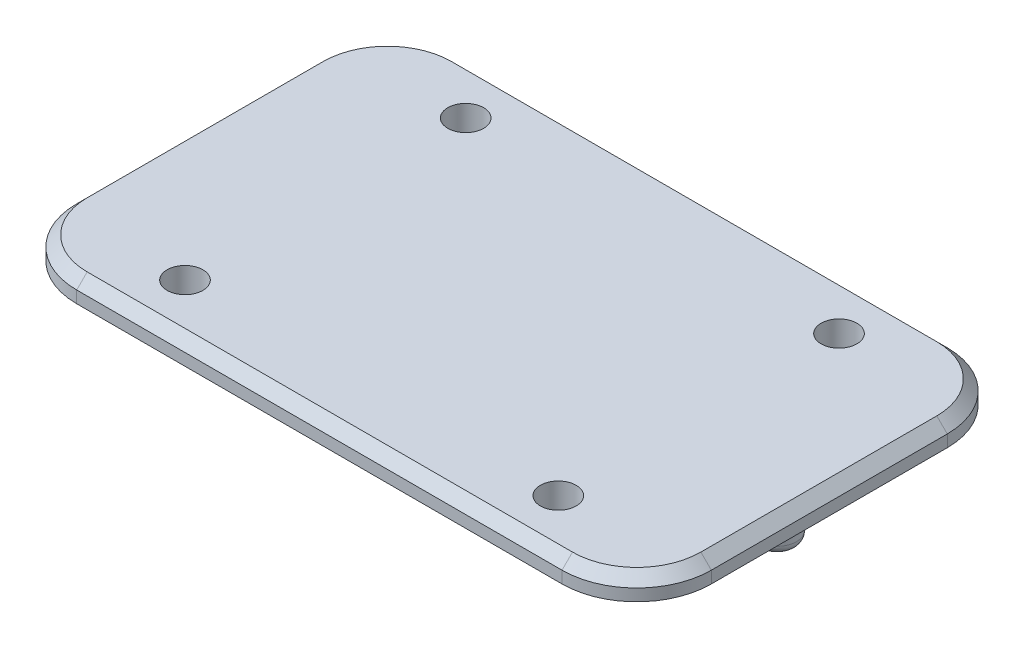
ISO-10303-21;
HEADER;
FILE_DESCRIPTION(('STEP AP214'),'2;1');
FILE_NAME('part.step','',(''),(''),'','','');
FILE_SCHEMA(('AUTOMOTIVE_DESIGN { 1 0 10303 214 1 1 1 1 }'));
ENDSEC;
DATA;
#1=APPLICATION_CONTEXT('core data for automotive mechanical design processes');
#2=APPLICATION_PROTOCOL_DEFINITION('international standard','automotive_design',2000,#1);
#3=PRODUCT_CONTEXT('',#1,'mechanical');
#4=PRODUCT('Part','Part','',(#3));
#5=PRODUCT_RELATED_PRODUCT_CATEGORY('part','',(#4));
#6=PRODUCT_DEFINITION_FORMATION('','',#4);
#7=PRODUCT_DEFINITION_CONTEXT('part definition',#1,'design');
#8=PRODUCT_DEFINITION('design','',#6,#7);
#9=PRODUCT_DEFINITION_SHAPE('','',#8);
#10=(LENGTH_UNIT() NAMED_UNIT(*) SI_UNIT(.MILLI.,.METRE.));
#11=(NAMED_UNIT(*) PLANE_ANGLE_UNIT() SI_UNIT($,.RADIAN.));
#12=(NAMED_UNIT(*) SI_UNIT($,.STERADIAN.) SOLID_ANGLE_UNIT());
#13=UNCERTAINTY_MEASURE_WITH_UNIT(LENGTH_MEASURE(1.E-05),#10,'distance_accuracy_value','');
#14=(GEOMETRIC_REPRESENTATION_CONTEXT(3) GLOBAL_UNCERTAINTY_ASSIGNED_CONTEXT((#13)) GLOBAL_UNIT_ASSIGNED_CONTEXT((#10,
#11,#12)) REPRESENTATION_CONTEXT('',''));
#15=CARTESIAN_POINT('',(0.,0.,0.));
#16=DIRECTION('',(0.,0.,1.));
#17=DIRECTION('',(1.,0.,0.));
#18=AXIS2_PLACEMENT_3D('',#15,#16,#17);
#19=CARTESIAN_POINT('',(21.25,1.5,-12.9));
#20=DIRECTION('',(0.,0.,1.));
#21=DIRECTION('',(1.,0.,0.));
#22=AXIS2_PLACEMENT_3D('',#19,#20,#21);
#23=PLANE('',#22);
#24=DIRECTION('',(0.,-1.,0.));
#25=VECTOR('',#24,1.);
#26=CARTESIAN_POINT('',(-16.25,1.5,-12.9));
#27=LINE('',#26,#25);
#28=CARTESIAN_POINT('',(-16.25,0.,-12.9));
#29=VERTEX_POINT('',#28);
#30=CARTESIAN_POINT('',(-16.25,0.799999999999987,-12.9));
#31=VERTEX_POINT('',#30);
#32=EDGE_CURVE('E330',#29,#31,#27,.F.);
#33=ORIENTED_EDGE('',*,*,#32,.T.);
#34=DIRECTION('',(1.,0.,0.));
#35=VECTOR('',#34,1.);
#36=CARTESIAN_POINT('',(16.25,0.799999999999987,-12.9));
#37=LINE('',#36,#35);
#38=CARTESIAN_POINT('',(16.25,0.799999999999987,-12.9));
#39=VERTEX_POINT('',#38);
#40=EDGE_CURVE('E364',#31,#39,#37,.T.);
#41=ORIENTED_EDGE('',*,*,#40,.T.);
#42=DIRECTION('',(0.,-1.,0.));
#43=VECTOR('',#42,1.);
#44=CARTESIAN_POINT('',(16.25,1.5,-12.9));
#45=LINE('',#44,#43);
#46=CARTESIAN_POINT('',(16.25,0.,-12.9));
#47=VERTEX_POINT('',#46);
#48=EDGE_CURVE('E333',#39,#47,#45,.T.);
#49=ORIENTED_EDGE('',*,*,#48,.T.);
#50=DIRECTION('',(-1.,0.,0.));
#51=VECTOR('',#50,1.);
#52=CARTESIAN_POINT('',(21.25,0.,-12.9));
#53=LINE('',#52,#51);
#54=EDGE_CURVE('E299',#47,#29,#53,.T.);
#55=ORIENTED_EDGE('',*,*,#54,.T.);
#56=EDGE_LOOP('',(#33,#41,#49,#55));
#57=FACE_BOUND('',#56,.T.);
#58=ADVANCED_FACE('F34',(#57),#23,.F.);
#59=CARTESIAN_POINT('',(-21.25,1.5,-12.9));
#60=DIRECTION('',(1.,0.,0.));
#61=DIRECTION('',(0.,0.,-1.));
#62=AXIS2_PLACEMENT_3D('',#59,#60,#61);
#63=PLANE('',#62);
#64=DIRECTION('',(0.,-1.,0.));
#65=VECTOR('',#64,1.);
#66=CARTESIAN_POINT('',(-21.25,1.5,7.9));
#67=LINE('',#66,#65);
#68=CARTESIAN_POINT('',(-21.25,0.,7.89999999999999));
#69=VERTEX_POINT('',#68);
#70=CARTESIAN_POINT('',(-21.25,0.799999999999987,7.9));
#71=VERTEX_POINT('',#70);
#72=EDGE_CURVE('E335',#69,#71,#67,.F.);
#73=ORIENTED_EDGE('',*,*,#72,.T.);
#74=DIRECTION('',(0.,0.,-1.));
#75=VECTOR('',#74,1.);
#76=CARTESIAN_POINT('',(-21.25,0.799999999999987,-7.9));
#77=LINE('',#76,#75);
#78=CARTESIAN_POINT('',(-21.25,0.799999999999987,-7.9));
#79=VERTEX_POINT('',#78);
#80=EDGE_CURVE('E372',#71,#79,#77,.T.);
#81=ORIENTED_EDGE('',*,*,#80,.T.);
#82=DIRECTION('',(0.,-1.,0.));
#83=VECTOR('',#82,1.);
#84=CARTESIAN_POINT('',(-21.25,1.5,-7.9));
#85=LINE('',#84,#83);
#86=CARTESIAN_POINT('',(-21.25,0.,-7.9));
#87=VERTEX_POINT('',#86);
#88=EDGE_CURVE('E338',#79,#87,#85,.T.);
#89=ORIENTED_EDGE('',*,*,#88,.T.);
#90=DIRECTION('',(0.,0.,1.));
#91=VECTOR('',#90,1.);
#92=CARTESIAN_POINT('',(-21.25,0.,-12.9));
#93=LINE('',#92,#91);
#94=EDGE_CURVE('E302',#87,#69,#93,.T.);
#95=ORIENTED_EDGE('',*,*,#94,.T.);
#96=EDGE_LOOP('',(#73,#81,#89,#95));
#97=FACE_BOUND('',#96,.T.);
#98=ADVANCED_FACE('F484',(#97),#63,.F.);
#99=CARTESIAN_POINT('',(21.25,1.5,12.9));
#100=DIRECTION('',(0.,0.,-1.));
#101=DIRECTION('',(-1.,0.,0.));
#102=AXIS2_PLACEMENT_3D('',#99,#100,#101);
#103=PLANE('',#102);
#104=DIRECTION('',(0.,-1.,0.));
#105=VECTOR('',#104,1.);
#106=CARTESIAN_POINT('',(16.25,1.5,12.9));
#107=LINE('',#106,#105);
#108=CARTESIAN_POINT('',(16.25,0.,12.9));
#109=VERTEX_POINT('',#108);
#110=CARTESIAN_POINT('',(16.25,0.799999999999987,12.9));
#111=VERTEX_POINT('',#110);
#112=EDGE_CURVE('E327',#109,#111,#107,.F.);
#113=ORIENTED_EDGE('',*,*,#112,.T.);
#114=DIRECTION('',(-1.,0.,0.));
#115=VECTOR('',#114,1.);
#116=CARTESIAN_POINT('',(-16.25,0.799999999999987,12.9));
#117=LINE('',#116,#115);
#118=CARTESIAN_POINT('',(-16.25,0.799999999999987,12.9));
#119=VERTEX_POINT('',#118);
#120=EDGE_CURVE('E366',#111,#119,#117,.T.);
#121=ORIENTED_EDGE('',*,*,#120,.T.);
#122=DIRECTION('',(0.,-1.,0.));
#123=VECTOR('',#122,1.);
#124=CARTESIAN_POINT('',(-16.25,1.5,12.9));
#125=LINE('',#124,#123);
#126=CARTESIAN_POINT('',(-16.25,0.,12.9));
#127=VERTEX_POINT('',#126);
#128=EDGE_CURVE('E325',#119,#127,#125,.T.);
#129=ORIENTED_EDGE('',*,*,#128,.T.);
#130=DIRECTION('',(1.,0.,0.));
#131=VECTOR('',#130,1.);
#132=CARTESIAN_POINT('',(21.25,0.,12.9));
#133=LINE('',#132,#131);
#134=EDGE_CURVE('E306',#127,#109,#133,.T.);
#135=ORIENTED_EDGE('',*,*,#134,.T.);
#136=EDGE_LOOP('',(#113,#121,#129,#135));
#137=FACE_BOUND('',#136,.T.);
#138=ADVANCED_FACE('F490',(#137),#103,.F.);
#139=CARTESIAN_POINT('',(21.25,1.5,-12.9));
#140=DIRECTION('',(-1.,0.,0.));
#141=DIRECTION('',(0.,0.,1.));
#142=AXIS2_PLACEMENT_3D('',#139,#140,#141);
#143=PLANE('',#142);
#144=DIRECTION('',(0.,-1.,0.));
#145=VECTOR('',#144,1.);
#146=CARTESIAN_POINT('',(21.25,1.5,-7.9));
#147=LINE('',#146,#145);
#148=CARTESIAN_POINT('',(21.25,0.,-7.9));
#149=VERTEX_POINT('',#148);
#150=CARTESIAN_POINT('',(21.25,0.799999999999987,-7.9));
#151=VERTEX_POINT('',#150);
#152=EDGE_CURVE('E312',#149,#151,#147,.F.);
#153=ORIENTED_EDGE('',*,*,#152,.T.);
#154=DIRECTION('',(0.,0.,1.));
#155=VECTOR('',#154,1.);
#156=CARTESIAN_POINT('',(21.25,0.799999999999987,7.89999999999999));
#157=LINE('',#156,#155);
#158=CARTESIAN_POINT('',(21.25,0.799999999999987,7.9));
#159=VERTEX_POINT('',#158);
#160=EDGE_CURVE('E357',#151,#159,#157,.T.);
#161=ORIENTED_EDGE('',*,*,#160,.T.);
#162=DIRECTION('',(0.,-1.,0.));
#163=VECTOR('',#162,1.);
#164=CARTESIAN_POINT('',(21.25,1.5,7.9));
#165=LINE('',#164,#163);
#166=CARTESIAN_POINT('',(21.25,0.,7.89999999999999));
#167=VERTEX_POINT('',#166);
#168=EDGE_CURVE('E315',#159,#167,#165,.T.);
#169=ORIENTED_EDGE('',*,*,#168,.T.);
#170=DIRECTION('',(0.,0.,-1.));
#171=VECTOR('',#170,1.);
#172=CARTESIAN_POINT('',(21.25,0.,-12.9));
#173=LINE('',#172,#171);
#174=EDGE_CURVE('E309',#167,#149,#173,.T.);
#175=ORIENTED_EDGE('',*,*,#174,.T.);
#176=EDGE_LOOP('',(#153,#161,#169,#175));
#177=FACE_BOUND('',#176,.T.);
#178=ADVANCED_FACE('F590',(#177),#143,.F.);
#179=CARTESIAN_POINT('',(0.,1.5,0.));
#180=DIRECTION('',(0.,1.,0.));
#181=DIRECTION('',(0.,0.,1.));
#182=AXIS2_PLACEMENT_3D('',#179,#180,#181);
#183=PLANE('',#182);
#184=CARTESIAN_POINT('',(-12.5,1.5,-9.4));
#185=DIRECTION('',(0.,-1.,0.));
#186=DIRECTION('',(0.,0.,-1.));
#187=AXIS2_PLACEMENT_3D('',#184,#185,#186);
#188=CIRCLE('',#187,1.2);
#189=CARTESIAN_POINT('',(-12.5,1.5,-10.6));
#190=VERTEX_POINT('',#189);
#191=EDGE_CURVE('E438',#190,#190,#188,.T.);
#192=ORIENTED_EDGE('',*,*,#191,.T.);
#193=EDGE_LOOP('',(#192));
#194=FACE_BOUND('',#193,.T.);
#195=CARTESIAN_POINT('',(12.5,1.5,-9.4));
#196=DIRECTION('',(0.,-1.,0.));
#197=DIRECTION('',(0.,0.,-1.));
#198=AXIS2_PLACEMENT_3D('',#195,#196,#197);
#199=CIRCLE('',#198,1.2);
#200=CARTESIAN_POINT('',(12.5,1.5,-10.6));
#201=VERTEX_POINT('',#200);
#202=EDGE_CURVE('E444',#201,#201,#199,.T.);
#203=ORIENTED_EDGE('',*,*,#202,.T.);
#204=EDGE_LOOP('',(#203));
#205=FACE_BOUND('',#204,.T.);
#206=CARTESIAN_POINT('',(12.5,1.5,9.4));
#207=DIRECTION('',(0.,-1.,0.));
#208=DIRECTION('',(0.,0.,-1.));
#209=AXIS2_PLACEMENT_3D('',#206,#207,#208);
#210=CIRCLE('',#209,1.2);
#211=CARTESIAN_POINT('',(12.5,1.5,8.2));
#212=VERTEX_POINT('',#211);
#213=EDGE_CURVE('E432',#212,#212,#210,.T.);
#214=ORIENTED_EDGE('',*,*,#213,.T.);
#215=EDGE_LOOP('',(#214));
#216=FACE_BOUND('',#215,.T.);
#217=CARTESIAN_POINT('',(-12.5,1.5,9.4));
#218=DIRECTION('',(0.,-1.,0.));
#219=DIRECTION('',(0.,0.,-1.));
#220=AXIS2_PLACEMENT_3D('',#217,#218,#219);
#221=CIRCLE('',#220,1.2);
#222=CARTESIAN_POINT('',(-12.5,1.5,8.2));
#223=VERTEX_POINT('',#222);
#224=EDGE_CURVE('E412',#223,#223,#221,.T.);
#225=ORIENTED_EDGE('',*,*,#224,.T.);
#226=EDGE_LOOP('',(#225));
#227=FACE_BOUND('',#226,.T.);
#228=CARTESIAN_POINT('',(16.25,1.5,7.9));
#229=DIRECTION('',(0.,1.,0.));
#230=DIRECTION('',(0.,0.,1.));
#231=AXIS2_PLACEMENT_3D('',#228,#229,#230);
#232=CIRCLE('',#231,4.29999999999999);
#233=CARTESIAN_POINT('',(16.25,1.5,12.2));
#234=VERTEX_POINT('',#233);
#235=CARTESIAN_POINT('',(20.55,1.5,7.9));
#236=VERTEX_POINT('',#235);
#237=EDGE_CURVE('E350',#234,#236,#232,.T.);
#238=ORIENTED_EDGE('',*,*,#237,.T.);
#239=DIRECTION('',(0.,0.,-1.));
#240=VECTOR('',#239,1.);
#241=CARTESIAN_POINT('',(20.55,1.5,-7.9));
#242=LINE('',#241,#240);
#243=CARTESIAN_POINT('',(20.55,1.5,-7.9));
#244=VERTEX_POINT('',#243);
#245=EDGE_CURVE('E354',#236,#244,#242,.T.);
#246=ORIENTED_EDGE('',*,*,#245,.T.);
#247=CARTESIAN_POINT('',(16.25,1.5,-7.9));
#248=DIRECTION('',(0.,1.,0.));
#249=DIRECTION('',(0.,0.,1.));
#250=AXIS2_PLACEMENT_3D('',#247,#248,#249);
#251=CIRCLE('',#250,4.29999999999999);
#252=CARTESIAN_POINT('',(16.25,1.5,-12.2));
#253=VERTEX_POINT('',#252);
#254=EDGE_CURVE('E352',#244,#253,#251,.T.);
#255=ORIENTED_EDGE('',*,*,#254,.T.);
#256=DIRECTION('',(-1.,0.,0.));
#257=VECTOR('',#256,1.);
#258=CARTESIAN_POINT('',(-16.25,1.5,-12.2));
#259=LINE('',#258,#257);
#260=CARTESIAN_POINT('',(-16.25,1.5,-12.2));
#261=VERTEX_POINT('',#260);
#262=EDGE_CURVE('E348',#253,#261,#259,.T.);
#263=ORIENTED_EDGE('',*,*,#262,.T.);
#264=CARTESIAN_POINT('',(-16.25,1.5,-7.9));
#265=DIRECTION('',(0.,1.,0.));
#266=DIRECTION('',(0.,0.,1.));
#267=AXIS2_PLACEMENT_3D('',#264,#265,#266);
#268=CIRCLE('',#267,4.29999999999999);
#269=CARTESIAN_POINT('',(-20.55,1.5,-7.9));
#270=VERTEX_POINT('',#269);
#271=EDGE_CURVE('E344',#261,#270,#268,.T.);
#272=ORIENTED_EDGE('',*,*,#271,.T.);
#273=DIRECTION('',(0.,0.,1.));
#274=VECTOR('',#273,1.);
#275=CARTESIAN_POINT('',(-20.55,1.5,7.89999999999999));
#276=LINE('',#275,#274);
#277=CARTESIAN_POINT('',(-20.55,1.5,7.9));
#278=VERTEX_POINT('',#277);
#279=EDGE_CURVE('E340',#270,#278,#276,.T.);
#280=ORIENTED_EDGE('',*,*,#279,.T.);
#281=CARTESIAN_POINT('',(-16.25,1.5,7.9));
#282=DIRECTION('',(0.,1.,0.));
#283=DIRECTION('',(0.,0.,1.));
#284=AXIS2_PLACEMENT_3D('',#281,#282,#283);
#285=CIRCLE('',#284,4.29999999999999);
#286=CARTESIAN_POINT('',(-16.25,1.5,12.2));
#287=VERTEX_POINT('',#286);
#288=EDGE_CURVE('E342',#278,#287,#285,.T.);
#289=ORIENTED_EDGE('',*,*,#288,.T.);
#290=DIRECTION('',(1.,0.,0.));
#291=VECTOR('',#290,1.);
#292=CARTESIAN_POINT('',(16.25,1.5,12.2));
#293=LINE('',#292,#291);
#294=EDGE_CURVE('E346',#287,#234,#293,.T.);
#295=ORIENTED_EDGE('',*,*,#294,.T.);
#296=EDGE_LOOP('',(#238,#246,#255,#263,#272,#280,#289,#295));
#297=FACE_BOUND('',#296,.T.);
#298=ADVANCED_FACE('F453',(#194,#205,#216,#227,#297),#183,.T.);
#299=CARTESIAN_POINT('',(0.,0.,0.));
#300=DIRECTION('',(0.,1.,0.));
#301=DIRECTION('',(0.,0.,1.));
#302=AXIS2_PLACEMENT_3D('',#299,#300,#301);
#303=PLANE('',#302);
#304=CARTESIAN_POINT('',(12.5,0.,9.4));
#305=DIRECTION('',(0.,1.,0.));
#306=DIRECTION('',(0.,0.,1.));
#307=AXIS2_PLACEMENT_3D('',#304,#305,#306);
#308=CIRCLE('',#307,1.3);
#309=CARTESIAN_POINT('',(12.5,0.,10.7));
#310=VERTEX_POINT('',#309);
#311=CARTESIAN_POINT('',(12.5,0.,8.1));
#312=VERTEX_POINT('',#311);
#313=EDGE_CURVE('E236',#310,#312,#308,.T.);
#314=ORIENTED_EDGE('',*,*,#313,.T.);
#315=DIRECTION('',(-1.,0.,0.));
#316=VECTOR('',#315,1.);
#317=CARTESIAN_POINT('',(12.5,0.,8.1));
#318=LINE('',#317,#316);
#319=CARTESIAN_POINT('',(-12.5,0.,8.1));
#320=VERTEX_POINT('',#319);
#321=EDGE_CURVE('E424',#312,#320,#318,.T.);
#322=ORIENTED_EDGE('',*,*,#321,.T.);
#323=CARTESIAN_POINT('',(-12.5,0.,9.4));
#324=DIRECTION('',(0.,1.,0.));
#325=DIRECTION('',(0.,0.,1.));
#326=AXIS2_PLACEMENT_3D('',#323,#324,#325);
#327=CIRCLE('',#326,1.3);
#328=CARTESIAN_POINT('',(-12.5,0.,10.7));
#329=VERTEX_POINT('',#328);
#330=EDGE_CURVE('E222',#320,#329,#327,.T.);
#331=ORIENTED_EDGE('',*,*,#330,.T.);
#332=DIRECTION('',(1.,0.,0.));
#333=VECTOR('',#332,1.);
#334=CARTESIAN_POINT('',(-12.5,0.,10.7));
#335=LINE('',#334,#333);
#336=EDGE_CURVE('E230',#329,#310,#335,.T.);
#337=ORIENTED_EDGE('',*,*,#336,.T.);
#338=EDGE_LOOP('',(#314,#322,#331,#337));
#339=FACE_BOUND('',#338,.T.);
#340=CARTESIAN_POINT('',(12.5,0.,-9.4));
#341=DIRECTION('',(0.,1.,0.));
#342=DIRECTION('',(0.,0.,1.));
#343=AXIS2_PLACEMENT_3D('',#340,#341,#342);
#344=CIRCLE('',#343,1.3);
#345=CARTESIAN_POINT('',(12.5,0.,-8.1));
#346=VERTEX_POINT('',#345);
#347=CARTESIAN_POINT('',(12.5,0.,-10.7));
#348=VERTEX_POINT('',#347);
#349=EDGE_CURVE('E245',#346,#348,#344,.T.);
#350=ORIENTED_EDGE('',*,*,#349,.T.);
#351=DIRECTION('',(-1.,0.,0.));
#352=VECTOR('',#351,1.);
#353=CARTESIAN_POINT('',(12.5,0.,-10.7));
#354=LINE('',#353,#352);
#355=CARTESIAN_POINT('',(-12.5,0.,-10.7));
#356=VERTEX_POINT('',#355);
#357=EDGE_CURVE('E253',#348,#356,#354,.T.);
#358=ORIENTED_EDGE('',*,*,#357,.T.);
#359=CARTESIAN_POINT('',(-12.5,0.,-9.4));
#360=DIRECTION('',(0.,1.,0.));
#361=DIRECTION('',(0.,0.,1.));
#362=AXIS2_PLACEMENT_3D('',#359,#360,#361);
#363=CIRCLE('',#362,1.3);
#364=CARTESIAN_POINT('',(-12.5,0.,-8.1));
#365=VERTEX_POINT('',#364);
#366=EDGE_CURVE('E250',#356,#365,#363,.T.);
#367=ORIENTED_EDGE('',*,*,#366,.T.);
#368=DIRECTION('',(1.,0.,0.));
#369=VECTOR('',#368,1.);
#370=CARTESIAN_POINT('',(-12.5,0.,-8.1));
#371=LINE('',#370,#369);
#372=EDGE_CURVE('E246',#365,#346,#371,.T.);
#373=ORIENTED_EDGE('',*,*,#372,.T.);
#374=EDGE_LOOP('',(#350,#358,#367,#373));
#375=FACE_BOUND('',#374,.T.);
#376=DIRECTION('',(1.,0.,0.));
#377=VECTOR('',#376,1.);
#378=CARTESIAN_POINT('',(-17.75,0.,1.30000000000001));
#379=LINE('',#378,#377);
#380=CARTESIAN_POINT('',(-17.75,0.,1.30000000000001));
#381=VERTEX_POINT('',#380);
#382=CARTESIAN_POINT('',(17.75,0.,1.3));
#383=VERTEX_POINT('',#382);
#384=EDGE_CURVE('E279',#381,#383,#379,.T.);
#385=ORIENTED_EDGE('',*,*,#384,.T.);
#386=CARTESIAN_POINT('',(17.75,0.,0.));
#387=DIRECTION('',(0.,1.,0.));
#388=DIRECTION('',(0.,0.,1.));
#389=AXIS2_PLACEMENT_3D('',#386,#387,#388);
#390=CIRCLE('',#389,1.3);
#391=CARTESIAN_POINT('',(17.75,0.,-1.3));
#392=VERTEX_POINT('',#391);
#393=EDGE_CURVE('E278',#383,#392,#390,.T.);
#394=ORIENTED_EDGE('',*,*,#393,.T.);
#395=DIRECTION('',(-1.,0.,0.));
#396=VECTOR('',#395,1.);
#397=CARTESIAN_POINT('',(17.75,0.,-1.3));
#398=LINE('',#397,#396);
#399=CARTESIAN_POINT('',(-17.75,0.,-1.3));
#400=VERTEX_POINT('',#399);
#401=EDGE_CURVE('E286',#392,#400,#398,.T.);
#402=ORIENTED_EDGE('',*,*,#401,.T.);
#403=CARTESIAN_POINT('',(-17.75,0.,0.));
#404=DIRECTION('',(0.,1.,0.));
#405=DIRECTION('',(0.,0.,1.));
#406=AXIS2_PLACEMENT_3D('',#403,#404,#405);
#407=CIRCLE('',#406,1.3);
#408=EDGE_CURVE('E283',#400,#381,#407,.T.);
#409=ORIENTED_EDGE('',*,*,#408,.T.);
#410=EDGE_LOOP('',(#385,#394,#402,#409));
#411=FACE_BOUND('',#410,.T.);
#412=ORIENTED_EDGE('',*,*,#174,.F.);
#413=CARTESIAN_POINT('',(16.25,0.,7.9));
#414=DIRECTION('',(0.,1.,0.));
#415=DIRECTION('',(0.,0.,1.));
#416=AXIS2_PLACEMENT_3D('',#413,#414,#415);
#417=CIRCLE('',#416,5.);
#418=EDGE_CURVE('E323',#167,#109,#417,.F.);
#419=ORIENTED_EDGE('',*,*,#418,.T.);
#420=ORIENTED_EDGE('',*,*,#134,.F.);
#421=CARTESIAN_POINT('',(-16.25,0.,7.9));
#422=DIRECTION('',(0.,1.,0.));
#423=DIRECTION('',(0.,0.,1.));
#424=AXIS2_PLACEMENT_3D('',#421,#422,#423);
#425=CIRCLE('',#424,5.);
#426=EDGE_CURVE('E317',#127,#69,#425,.F.);
#427=ORIENTED_EDGE('',*,*,#426,.T.);
#428=ORIENTED_EDGE('',*,*,#94,.F.);
#429=CARTESIAN_POINT('',(-16.25,0.,-7.9));
#430=DIRECTION('',(0.,1.,0.));
#431=DIRECTION('',(0.,0.,1.));
#432=AXIS2_PLACEMENT_3D('',#429,#430,#431);
#433=CIRCLE('',#432,5.);
#434=EDGE_CURVE('E319',#87,#29,#433,.F.);
#435=ORIENTED_EDGE('',*,*,#434,.T.);
#436=ORIENTED_EDGE('',*,*,#54,.F.);
#437=CARTESIAN_POINT('',(16.25,0.,-7.9));
#438=DIRECTION('',(0.,1.,0.));
#439=DIRECTION('',(0.,0.,1.));
#440=AXIS2_PLACEMENT_3D('',#437,#438,#439);
#441=CIRCLE('',#440,5.);
#442=EDGE_CURVE('E321',#47,#149,#441,.F.);
#443=ORIENTED_EDGE('',*,*,#442,.T.);
#444=EDGE_LOOP('',(#412,#419,#420,#427,#428,#435,#436,#443));
#445=FACE_BOUND('',#444,.T.);
#446=ADVANCED_FACE('F499',(#339,#375,#411,#445),#303,.F.);
#447=CARTESIAN_POINT('',(16.25,1.5,7.9));
#448=DIRECTION('',(0.,-1.,0.));
#449=DIRECTION('',(0.,0.,-1.));
#450=AXIS2_PLACEMENT_3D('',#447,#448,#449);
#451=CYLINDRICAL_SURFACE('',#450,5.);
#452=ORIENTED_EDGE('',*,*,#168,.F.);
#453=CARTESIAN_POINT('',(16.25,0.799999999999987,7.9));
#454=DIRECTION('',(0.,1.,0.));
#455=DIRECTION('',(0.,0.,1.));
#456=AXIS2_PLACEMENT_3D('',#453,#454,#455);
#457=CIRCLE('',#456,5.);
#458=EDGE_CURVE('E362',#159,#111,#457,.F.);
#459=ORIENTED_EDGE('',*,*,#458,.T.);
#460=ORIENTED_EDGE('',*,*,#112,.F.);
#461=ORIENTED_EDGE('',*,*,#418,.F.);
#462=EDGE_LOOP('',(#452,#459,#460,#461));
#463=FACE_BOUND('',#462,.T.);
#464=ADVANCED_FACE('F495',(#463),#451,.T.);
#465=CARTESIAN_POINT('',(16.25,1.5,-7.9));
#466=DIRECTION('',(0.,-1.,0.));
#467=DIRECTION('',(0.,0.,-1.));
#468=AXIS2_PLACEMENT_3D('',#465,#466,#467);
#469=CYLINDRICAL_SURFACE('',#468,5.);
#470=ORIENTED_EDGE('',*,*,#48,.F.);
#471=CARTESIAN_POINT('',(16.25,0.799999999999987,-7.9));
#472=DIRECTION('',(0.,1.,0.));
#473=DIRECTION('',(0.,0.,1.));
#474=AXIS2_PLACEMENT_3D('',#471,#472,#473);
#475=CIRCLE('',#474,5.);
#476=EDGE_CURVE('E360',#39,#151,#475,.F.);
#477=ORIENTED_EDGE('',*,*,#476,.T.);
#478=ORIENTED_EDGE('',*,*,#152,.F.);
#479=ORIENTED_EDGE('',*,*,#442,.F.);
#480=EDGE_LOOP('',(#470,#477,#478,#479));
#481=FACE_BOUND('',#480,.T.);
#482=ADVANCED_FACE('F498',(#481),#469,.T.);
#483=CARTESIAN_POINT('',(-16.25,1.5,-7.9));
#484=DIRECTION('',(0.,-1.,0.));
#485=DIRECTION('',(0.,0.,-1.));
#486=AXIS2_PLACEMENT_3D('',#483,#484,#485);
#487=CYLINDRICAL_SURFACE('',#486,5.);
#488=ORIENTED_EDGE('',*,*,#88,.F.);
#489=CARTESIAN_POINT('',(-16.25,0.799999999999987,-7.9));
#490=DIRECTION('',(0.,1.,0.));
#491=DIRECTION('',(0.,0.,1.));
#492=AXIS2_PLACEMENT_3D('',#489,#490,#491);
#493=CIRCLE('',#492,5.);
#494=EDGE_CURVE('E368',#79,#31,#493,.F.);
#495=ORIENTED_EDGE('',*,*,#494,.T.);
#496=ORIENTED_EDGE('',*,*,#32,.F.);
#497=ORIENTED_EDGE('',*,*,#434,.F.);
#498=EDGE_LOOP('',(#488,#495,#496,#497));
#499=FACE_BOUND('',#498,.T.);
#500=ADVANCED_FACE('F503',(#499),#487,.T.);
#501=CARTESIAN_POINT('',(-16.25,1.5,7.9));
#502=DIRECTION('',(0.,-1.,0.));
#503=DIRECTION('',(0.,0.,-1.));
#504=AXIS2_PLACEMENT_3D('',#501,#502,#503);
#505=CYLINDRICAL_SURFACE('',#504,5.);
#506=ORIENTED_EDGE('',*,*,#128,.F.);
#507=CARTESIAN_POINT('',(-16.25,0.799999999999987,7.9));
#508=DIRECTION('',(0.,1.,0.));
#509=DIRECTION('',(0.,0.,1.));
#510=AXIS2_PLACEMENT_3D('',#507,#508,#509);
#511=CIRCLE('',#510,5.);
#512=EDGE_CURVE('E370',#119,#71,#511,.F.);
#513=ORIENTED_EDGE('',*,*,#512,.T.);
#514=ORIENTED_EDGE('',*,*,#72,.F.);
#515=ORIENTED_EDGE('',*,*,#426,.F.);
#516=EDGE_LOOP('',(#506,#513,#514,#515));
#517=FACE_BOUND('',#516,.T.);
#518=ADVANCED_FACE('F507',(#517),#505,.T.);
#519=CARTESIAN_POINT('',(-20.55,1.5,0.));
#520=DIRECTION('',(-0.707106781186551,0.707106781186544,0.));
#521=DIRECTION('',(0.,0.,-1.));
#522=AXIS2_PLACEMENT_3D('',#519,#520,#521);
#523=PLANE('',#522);
#524=DIRECTION('',(0.707106781186544,0.707106781186551,0.));
#525=VECTOR('',#524,1.);
#526=CARTESIAN_POINT('',(-21.25,0.799999999999987,-7.9));
#527=LINE('',#526,#525);
#528=EDGE_CURVE('E390',#79,#270,#527,.T.);
#529=ORIENTED_EDGE('',*,*,#528,.F.);
#530=ORIENTED_EDGE('',*,*,#80,.F.);
#531=DIRECTION('',(-0.707106781186544,-0.707106781186551,0.));
#532=VECTOR('',#531,1.);
#533=CARTESIAN_POINT('',(-20.55,1.5,7.9));
#534=LINE('',#533,#532);
#535=EDGE_CURVE('E303',#278,#71,#534,.T.);
#536=ORIENTED_EDGE('',*,*,#535,.F.);
#537=ORIENTED_EDGE('',*,*,#279,.F.);
#538=EDGE_LOOP('',(#529,#530,#536,#537));
#539=FACE_BOUND('',#538,.T.);
#540=ADVANCED_FACE('F511',(#539),#523,.T.);
#541=CARTESIAN_POINT('',(-16.25,1.5,7.9));
#542=DIRECTION('',(0.,-1.,0.));
#543=DIRECTION('',(0.,0.,-1.));
#544=AXIS2_PLACEMENT_3D('',#541,#542,#543);
#545=CONICAL_SURFACE('',#544,4.29999999999999,0.785398163397443);
#546=ORIENTED_EDGE('',*,*,#535,.T.);
#547=ORIENTED_EDGE('',*,*,#512,.F.);
#548=DIRECTION('',(0.,-0.707106781186552,0.707106781186543));
#549=VECTOR('',#548,1.);
#550=CARTESIAN_POINT('',(-16.25,1.5,12.2));
#551=LINE('',#550,#549);
#552=EDGE_CURVE('E387',#287,#119,#551,.T.);
#553=ORIENTED_EDGE('',*,*,#552,.F.);
#554=ORIENTED_EDGE('',*,*,#288,.F.);
#555=EDGE_LOOP('',(#546,#547,#553,#554));
#556=FACE_BOUND('',#555,.T.);
#557=ADVANCED_FACE('F537',(#556),#545,.T.);
#558=CARTESIAN_POINT('',(-16.25,1.5,-7.9));
#559=DIRECTION('',(0.,-1.,0.));
#560=DIRECTION('',(0.,0.,-1.));
#561=AXIS2_PLACEMENT_3D('',#558,#559,#560);
#562=CONICAL_SURFACE('',#561,4.29999999999999,0.785398163397444);
#563=ORIENTED_EDGE('',*,*,#528,.T.);
#564=ORIENTED_EDGE('',*,*,#271,.F.);
#565=DIRECTION('',(0.,0.707106781186551,0.707106781186544));
#566=VECTOR('',#565,1.);
#567=CARTESIAN_POINT('',(-16.25,0.799999999999987,-12.9));
#568=LINE('',#567,#566);
#569=EDGE_CURVE('E384',#31,#261,#568,.T.);
#570=ORIENTED_EDGE('',*,*,#569,.F.);
#571=ORIENTED_EDGE('',*,*,#494,.F.);
#572=EDGE_LOOP('',(#563,#564,#570,#571));
#573=FACE_BOUND('',#572,.T.);
#574=ADVANCED_FACE('F533',(#573),#562,.T.);
#575=CARTESIAN_POINT('',(0.,1.5,12.2));
#576=DIRECTION('',(0.,0.707106781186544,0.707106781186551));
#577=DIRECTION('',(-1.,0.,0.));
#578=AXIS2_PLACEMENT_3D('',#575,#576,#577);
#579=PLANE('',#578);
#580=ORIENTED_EDGE('',*,*,#552,.T.);
#581=ORIENTED_EDGE('',*,*,#120,.F.);
#582=DIRECTION('',(0.,-0.707106781186551,0.707106781186544));
#583=VECTOR('',#582,1.);
#584=CARTESIAN_POINT('',(16.25,1.5,12.2));
#585=LINE('',#584,#583);
#586=EDGE_CURVE('E381',#234,#111,#585,.T.);
#587=ORIENTED_EDGE('',*,*,#586,.F.);
#588=ORIENTED_EDGE('',*,*,#294,.F.);
#589=EDGE_LOOP('',(#580,#581,#587,#588));
#590=FACE_BOUND('',#589,.T.);
#591=ADVANCED_FACE('F529',(#590),#579,.T.);
#592=CARTESIAN_POINT('',(0.,1.5,-12.2));
#593=DIRECTION('',(0.,0.707106781186544,-0.707106781186551));
#594=DIRECTION('',(1.,0.,0.));
#595=AXIS2_PLACEMENT_3D('',#592,#593,#594);
#596=PLANE('',#595);
#597=ORIENTED_EDGE('',*,*,#569,.T.);
#598=ORIENTED_EDGE('',*,*,#262,.F.);
#599=DIRECTION('',(0.,0.707106781186551,0.707106781186544));
#600=VECTOR('',#599,1.);
#601=CARTESIAN_POINT('',(16.25,0.799999999999987,-12.9));
#602=LINE('',#601,#600);
#603=EDGE_CURVE('E378',#39,#253,#602,.T.);
#604=ORIENTED_EDGE('',*,*,#603,.F.);
#605=ORIENTED_EDGE('',*,*,#40,.F.);
#606=EDGE_LOOP('',(#597,#598,#604,#605));
#607=FACE_BOUND('',#606,.T.);
#608=ADVANCED_FACE('F525',(#607),#596,.T.);
#609=CARTESIAN_POINT('',(16.25,1.5,7.9));
#610=DIRECTION('',(0.,-1.,0.));
#611=DIRECTION('',(0.,0.,-1.));
#612=AXIS2_PLACEMENT_3D('',#609,#610,#611);
#613=CONICAL_SURFACE('',#612,4.29999999999999,0.785398163397443);
#614=ORIENTED_EDGE('',*,*,#586,.T.);
#615=ORIENTED_EDGE('',*,*,#458,.F.);
#616=DIRECTION('',(0.707106781186544,-0.707106781186551,0.));
#617=VECTOR('',#616,1.);
#618=CARTESIAN_POINT('',(20.55,1.5,7.9));
#619=LINE('',#618,#617);
#620=EDGE_CURVE('E376',#236,#159,#619,.T.);
#621=ORIENTED_EDGE('',*,*,#620,.F.);
#622=ORIENTED_EDGE('',*,*,#237,.F.);
#623=EDGE_LOOP('',(#614,#615,#621,#622));
#624=FACE_BOUND('',#623,.T.);
#625=ADVANCED_FACE('F521',(#624),#613,.T.);
#626=CARTESIAN_POINT('',(16.25,1.5,-7.9));
#627=DIRECTION('',(0.,-1.,0.));
#628=DIRECTION('',(0.,0.,-1.));
#629=AXIS2_PLACEMENT_3D('',#626,#627,#628);
#630=CONICAL_SURFACE('',#629,4.29999999999999,0.785398163397443);
#631=ORIENTED_EDGE('',*,*,#603,.T.);
#632=ORIENTED_EDGE('',*,*,#254,.F.);
#633=DIRECTION('',(-0.707106781186544,0.707106781186551,0.));
#634=VECTOR('',#633,1.);
#635=CARTESIAN_POINT('',(21.25,0.799999999999987,-7.9));
#636=LINE('',#635,#634);
#637=EDGE_CURVE('E298',#151,#244,#636,.T.);
#638=ORIENTED_EDGE('',*,*,#637,.F.);
#639=ORIENTED_EDGE('',*,*,#476,.F.);
#640=EDGE_LOOP('',(#631,#632,#638,#639));
#641=FACE_BOUND('',#640,.T.);
#642=ADVANCED_FACE('F517',(#641),#630,.T.);
#643=CARTESIAN_POINT('',(20.55,1.5,0.));
#644=DIRECTION('',(0.707106781186551,0.707106781186544,0.));
#645=DIRECTION('',(0.,0.,1.));
#646=AXIS2_PLACEMENT_3D('',#643,#644,#645);
#647=PLANE('',#646);
#648=ORIENTED_EDGE('',*,*,#620,.T.);
#649=ORIENTED_EDGE('',*,*,#160,.F.);
#650=ORIENTED_EDGE('',*,*,#637,.T.);
#651=ORIENTED_EDGE('',*,*,#245,.F.);
#652=EDGE_LOOP('',(#648,#649,#650,#651));
#653=FACE_BOUND('',#652,.T.);
#654=ADVANCED_FACE('F513',(#653),#647,.T.);
#655=CARTESIAN_POINT('',(17.75,-39.6886108676396,-1.3));
#656=DIRECTION('',(0.,0.,-1.));
#657=DIRECTION('',(-1.,0.,0.));
#658=AXIS2_PLACEMENT_3D('',#655,#656,#657);
#659=PLANE('',#658);
#660=DIRECTION('',(0.,1.,0.));
#661=VECTOR('',#660,1.);
#662=CARTESIAN_POINT('',(17.75,-39.6886108676396,-1.3));
#663=LINE('',#662,#661);
#664=CARTESIAN_POINT('',(17.75,-2.6,-1.3));
#665=VERTEX_POINT('',#664);
#666=EDGE_CURVE('E293',#665,#392,#663,.T.);
#667=ORIENTED_EDGE('',*,*,#666,.F.);
#668=DIRECTION('',(-1.,0.,0.));
#669=VECTOR('',#668,1.);
#670=CARTESIAN_POINT('',(-17.75,-2.6,-1.3));
#671=LINE('',#670,#669);
#672=CARTESIAN_POINT('',(-17.75,-2.6,-1.3));
#673=VERTEX_POINT('',#672);
#674=EDGE_CURVE('E406',#665,#673,#671,.T.);
#675=ORIENTED_EDGE('',*,*,#674,.T.);
#676=DIRECTION('',(0.,1.,0.));
#677=VECTOR('',#676,1.);
#678=CARTESIAN_POINT('',(-17.75,-39.6886108676396,-1.3));
#679=LINE('',#678,#677);
#680=EDGE_CURVE('E282',#673,#400,#679,.T.);
#681=ORIENTED_EDGE('',*,*,#680,.T.);
#682=ORIENTED_EDGE('',*,*,#401,.F.);
#683=EDGE_LOOP('',(#667,#675,#681,#682));
#684=FACE_BOUND('',#683,.T.);
#685=ADVANCED_FACE('F516',(#684),#659,.T.);
#686=CARTESIAN_POINT('',(-17.75,-39.6886108676396,0.));
#687=DIRECTION('',(0.,1.,0.));
#688=DIRECTION('',(0.,0.,1.));
#689=AXIS2_PLACEMENT_3D('',#686,#687,#688);
#690=CYLINDRICAL_SURFACE('',#689,1.3);
#691=ORIENTED_EDGE('',*,*,#680,.F.);
#692=CARTESIAN_POINT('',(-17.75,-2.6,0.));
#693=DIRECTION('',(0.,1.,0.));
#694=DIRECTION('',(0.,0.,1.));
#695=AXIS2_PLACEMENT_3D('',#692,#693,#694);
#696=CIRCLE('',#695,1.3);
#697=CARTESIAN_POINT('',(-17.75,-2.6,1.30000000000001));
#698=VERTEX_POINT('',#697);
#699=EDGE_CURVE('E374',#673,#698,#696,.T.);
#700=ORIENTED_EDGE('',*,*,#699,.T.);
#701=DIRECTION('',(0.,1.,0.));
#702=VECTOR('',#701,1.);
#703=CARTESIAN_POINT('',(-17.75,-39.6886108676396,1.30000000000001));
#704=LINE('',#703,#702);
#705=EDGE_CURVE('E294',#698,#381,#704,.T.);
#706=ORIENTED_EDGE('',*,*,#705,.T.);
#707=ORIENTED_EDGE('',*,*,#408,.F.);
#708=EDGE_LOOP('',(#691,#700,#706,#707));
#709=FACE_BOUND('',#708,.T.);
#710=ADVANCED_FACE('F568',(#709),#690,.T.);
#711=CARTESIAN_POINT('',(-17.75,-39.6886108676396,1.30000000000001));
#712=DIRECTION('',(0.,0.,1.));
#713=DIRECTION('',(1.,0.,0.));
#714=AXIS2_PLACEMENT_3D('',#711,#712,#713);
#715=PLANE('',#714);
#716=ORIENTED_EDGE('',*,*,#705,.F.);
#717=DIRECTION('',(1.,0.,0.));
#718=VECTOR('',#717,1.);
#719=CARTESIAN_POINT('',(17.75,-2.6,1.3));
#720=LINE('',#719,#718);
#721=CARTESIAN_POINT('',(17.75,-2.6,1.3));
#722=VERTEX_POINT('',#721);
#723=EDGE_CURVE('E12',#698,#722,#720,.T.);
#724=ORIENTED_EDGE('',*,*,#723,.T.);
#725=DIRECTION('',(0.,1.,0.));
#726=VECTOR('',#725,1.);
#727=CARTESIAN_POINT('',(17.75,-39.6886108676396,1.3));
#728=LINE('',#727,#726);
#729=EDGE_CURVE('E291',#722,#383,#728,.T.);
#730=ORIENTED_EDGE('',*,*,#729,.T.);
#731=ORIENTED_EDGE('',*,*,#384,.F.);
#732=EDGE_LOOP('',(#716,#724,#730,#731));
#733=FACE_BOUND('',#732,.T.);
#734=ADVANCED_FACE('F574',(#733),#715,.T.);
#735=CARTESIAN_POINT('',(17.75,-39.6886108676396,0.));
#736=DIRECTION('',(0.,1.,0.));
#737=DIRECTION('',(0.,0.,1.));
#738=AXIS2_PLACEMENT_3D('',#735,#736,#737);
#739=CYLINDRICAL_SURFACE('',#738,1.3);
#740=ORIENTED_EDGE('',*,*,#729,.F.);
#741=CARTESIAN_POINT('',(17.75,-2.6,0.));
#742=DIRECTION('',(0.,1.,0.));
#743=DIRECTION('',(0.,0.,1.));
#744=AXIS2_PLACEMENT_3D('',#741,#742,#743);
#745=CIRCLE('',#744,1.3);
#746=EDGE_CURVE('E43',#722,#665,#745,.T.);
#747=ORIENTED_EDGE('',*,*,#746,.T.);
#748=ORIENTED_EDGE('',*,*,#666,.T.);
#749=ORIENTED_EDGE('',*,*,#393,.F.);
#750=EDGE_LOOP('',(#740,#747,#748,#749));
#751=FACE_BOUND('',#750,.T.);
#752=ADVANCED_FACE('F573',(#751),#739,.T.);
#753=CARTESIAN_POINT('',(0.,-1.5,0.));
#754=DIRECTION('',(0.,-1.,0.));
#755=DIRECTION('',(1.,0.,0.));
#756=AXIS2_PLACEMENT_3D('',#753,#754,#755);
#757=PLANE('',#756);
#758=CARTESIAN_POINT('',(-12.5,-1.5,-9.4));
#759=DIRECTION('',(0.,-1.,0.));
#760=DIRECTION('',(0.,0.,-1.));
#761=AXIS2_PLACEMENT_3D('',#758,#759,#760);
#762=CIRCLE('',#761,1.2);
#763=CARTESIAN_POINT('',(-12.5,-1.5,-10.6));
#764=VERTEX_POINT('',#763);
#765=EDGE_CURVE('E435',#764,#764,#762,.T.);
#766=ORIENTED_EDGE('',*,*,#765,.F.);
#767=EDGE_LOOP('',(#766));
#768=FACE_BOUND('',#767,.T.);
#769=CARTESIAN_POINT('',(12.5,-1.5,-9.4));
#770=DIRECTION('',(0.,-1.,0.));
#771=DIRECTION('',(0.,0.,-1.));
#772=AXIS2_PLACEMENT_3D('',#769,#770,#771);
#773=CIRCLE('',#772,1.2);
#774=CARTESIAN_POINT('',(12.5,-1.5,-10.6));
#775=VERTEX_POINT('',#774);
#776=EDGE_CURVE('E441',#775,#775,#773,.T.);
#777=ORIENTED_EDGE('',*,*,#776,.F.);
#778=EDGE_LOOP('',(#777));
#779=FACE_BOUND('',#778,.T.);
#780=CARTESIAN_POINT('',(12.5,-1.5,-9.4));
#781=DIRECTION('',(0.,-1.,0.));
#782=DIRECTION('',(0.,0.,-1.));
#783=AXIS2_PLACEMENT_3D('',#780,#781,#782);
#784=CIRCLE('',#783,1.3);
#785=CARTESIAN_POINT('',(12.5,-1.5,-8.1));
#786=VERTEX_POINT('',#785);
#787=CARTESIAN_POINT('',(12.5,-1.5,-10.7));
#788=VERTEX_POINT('',#787);
#789=EDGE_CURVE('E261',#786,#788,#784,.F.);
#790=ORIENTED_EDGE('',*,*,#789,.F.);
#791=DIRECTION('',(1.,0.,0.));
#792=VECTOR('',#791,1.);
#793=CARTESIAN_POINT('',(-12.5,-1.5,-8.1));
#794=LINE('',#793,#792);
#795=CARTESIAN_POINT('',(-12.5,-1.5,-8.1));
#796=VERTEX_POINT('',#795);
#797=EDGE_CURVE('E266',#796,#786,#794,.T.);
#798=ORIENTED_EDGE('',*,*,#797,.F.);
#799=CARTESIAN_POINT('',(-12.5,-1.5,-9.4));
#800=DIRECTION('',(0.,-1.,0.));
#801=DIRECTION('',(0.,0.,-1.));
#802=AXIS2_PLACEMENT_3D('',#799,#800,#801);
#803=CIRCLE('',#802,1.3);
#804=CARTESIAN_POINT('',(-12.5,-1.5,-10.7));
#805=VERTEX_POINT('',#804);
#806=EDGE_CURVE('E270',#805,#796,#803,.F.);
#807=ORIENTED_EDGE('',*,*,#806,.F.);
#808=DIRECTION('',(-1.,0.,0.));
#809=VECTOR('',#808,1.);
#810=CARTESIAN_POINT('',(12.5,-1.5,-10.7));
#811=LINE('',#810,#809);
#812=EDGE_CURVE('E249',#788,#805,#811,.T.);
#813=ORIENTED_EDGE('',*,*,#812,.F.);
#814=EDGE_LOOP('',(#790,#798,#807,#813));
#815=FACE_BOUND('',#814,.T.);
#816=ADVANCED_FACE('F581',(#768,#779,#815),#757,.T.);
#817=CARTESIAN_POINT('',(12.5,-39.6886108676396,-10.7));
#818=DIRECTION('',(0.,0.,-1.));
#819=DIRECTION('',(-1.,0.,0.));
#820=AXIS2_PLACEMENT_3D('',#817,#818,#819);
#821=PLANE('',#820);
#822=DIRECTION('',(0.,1.,0.));
#823=VECTOR('',#822,1.);
#824=CARTESIAN_POINT('',(12.5,-39.6886108676396,-10.7));
#825=LINE('',#824,#823);
#826=EDGE_CURVE('E264',#788,#348,#825,.T.);
#827=ORIENTED_EDGE('',*,*,#826,.F.);
#828=ORIENTED_EDGE('',*,*,#812,.T.);
#829=DIRECTION('',(0.,1.,0.));
#830=VECTOR('',#829,1.);
#831=CARTESIAN_POINT('',(-12.5,-39.6886108676396,-10.7));
#832=LINE('',#831,#830);
#833=EDGE_CURVE('E260',#805,#356,#832,.T.);
#834=ORIENTED_EDGE('',*,*,#833,.T.);
#835=ORIENTED_EDGE('',*,*,#357,.F.);
#836=EDGE_LOOP('',(#827,#828,#834,#835));
#837=FACE_BOUND('',#836,.T.);
#838=ADVANCED_FACE('F793',(#837),#821,.T.);
#839=CARTESIAN_POINT('',(-12.5,-39.6886108676396,-9.4));
#840=DIRECTION('',(0.,1.,0.));
#841=DIRECTION('',(0.,0.,1.));
#842=AXIS2_PLACEMENT_3D('',#839,#840,#841);
#843=CYLINDRICAL_SURFACE('',#842,1.3);
#844=ORIENTED_EDGE('',*,*,#833,.F.);
#845=ORIENTED_EDGE('',*,*,#806,.T.);
#846=DIRECTION('',(0.,1.,0.));
#847=VECTOR('',#846,1.);
#848=CARTESIAN_POINT('',(-12.5,-39.6886108676396,-8.1));
#849=LINE('',#848,#847);
#850=EDGE_CURVE('E269',#796,#365,#849,.T.);
#851=ORIENTED_EDGE('',*,*,#850,.T.);
#852=ORIENTED_EDGE('',*,*,#366,.F.);
#853=EDGE_LOOP('',(#844,#845,#851,#852));
#854=FACE_BOUND('',#853,.T.);
#855=ADVANCED_FACE('F807',(#854),#843,.T.);
#856=CARTESIAN_POINT('',(-12.5,-39.6886108676396,-8.1));
#857=DIRECTION('',(0.,0.,1.));
#858=DIRECTION('',(1.,0.,0.));
#859=AXIS2_PLACEMENT_3D('',#856,#857,#858);
#860=PLANE('',#859);
#861=ORIENTED_EDGE('',*,*,#850,.F.);
#862=ORIENTED_EDGE('',*,*,#797,.T.);
#863=DIRECTION('',(0.,1.,0.));
#864=VECTOR('',#863,1.);
#865=CARTESIAN_POINT('',(12.5,-39.6886108676396,-8.1));
#866=LINE('',#865,#864);
#867=EDGE_CURVE('E265',#786,#346,#866,.T.);
#868=ORIENTED_EDGE('',*,*,#867,.T.);
#869=ORIENTED_EDGE('',*,*,#372,.F.);
#870=EDGE_LOOP('',(#861,#862,#868,#869));
#871=FACE_BOUND('',#870,.T.);
#872=ADVANCED_FACE('F803',(#871),#860,.T.);
#873=CARTESIAN_POINT('',(12.5,-39.6886108676396,-9.4));
#874=DIRECTION('',(0.,1.,0.));
#875=DIRECTION('',(0.,0.,1.));
#876=AXIS2_PLACEMENT_3D('',#873,#874,#875);
#877=CYLINDRICAL_SURFACE('',#876,1.3);
#878=ORIENTED_EDGE('',*,*,#867,.F.);
#879=ORIENTED_EDGE('',*,*,#789,.T.);
#880=ORIENTED_EDGE('',*,*,#826,.T.);
#881=ORIENTED_EDGE('',*,*,#349,.F.);
#882=EDGE_LOOP('',(#878,#879,#880,#881));
#883=FACE_BOUND('',#882,.T.);
#884=ADVANCED_FACE('F466',(#883),#877,.T.);
#885=CARTESIAN_POINT('',(0.,-1.5,0.));
#886=DIRECTION('',(0.,-1.,0.));
#887=DIRECTION('',(1.,0.,0.));
#888=AXIS2_PLACEMENT_3D('',#885,#886,#887);
#889=PLANE('',#888);
#890=CARTESIAN_POINT('',(12.5,-1.5,9.4));
#891=DIRECTION('',(0.,-1.,0.));
#892=DIRECTION('',(0.,0.,-1.));
#893=AXIS2_PLACEMENT_3D('',#890,#891,#892);
#894=CIRCLE('',#893,1.2);
#895=CARTESIAN_POINT('',(12.5,-1.5,8.2));
#896=VERTEX_POINT('',#895);
#897=EDGE_CURVE('E447',#896,#896,#894,.T.);
#898=ORIENTED_EDGE('',*,*,#897,.F.);
#899=EDGE_LOOP('',(#898));
#900=FACE_BOUND('',#899,.T.);
#901=CARTESIAN_POINT('',(-12.5,-1.5,9.4));
#902=DIRECTION('',(0.,-1.,0.));
#903=DIRECTION('',(0.,0.,-1.));
#904=AXIS2_PLACEMENT_3D('',#901,#902,#903);
#905=CIRCLE('',#904,1.2);
#906=CARTESIAN_POINT('',(-12.5,-1.5,8.2));
#907=VERTEX_POINT('',#906);
#908=EDGE_CURVE('E429',#907,#907,#905,.T.);
#909=ORIENTED_EDGE('',*,*,#908,.F.);
#910=EDGE_LOOP('',(#909));
#911=FACE_BOUND('',#910,.T.);
#912=CARTESIAN_POINT('',(12.5,-1.5,9.4));
#913=DIRECTION('',(0.,-1.,0.));
#914=DIRECTION('',(0.,0.,-1.));
#915=AXIS2_PLACEMENT_3D('',#912,#913,#914);
#916=CIRCLE('',#915,1.3);
#917=CARTESIAN_POINT('',(12.5,-1.5,10.7));
#918=VERTEX_POINT('',#917);
#919=CARTESIAN_POINT('',(12.5,-1.5,8.1));
#920=VERTEX_POINT('',#919);
#921=EDGE_CURVE('E238',#918,#920,#916,.F.);
#922=ORIENTED_EDGE('',*,*,#921,.F.);
#923=DIRECTION('',(1.,0.,0.));
#924=VECTOR('',#923,1.);
#925=CARTESIAN_POINT('',(-12.5,-1.5,10.7));
#926=LINE('',#925,#924);
#927=CARTESIAN_POINT('',(-12.5,-1.5,10.7));
#928=VERTEX_POINT('',#927);
#929=EDGE_CURVE('E213',#928,#918,#926,.T.);
#930=ORIENTED_EDGE('',*,*,#929,.F.);
#931=CARTESIAN_POINT('',(-12.5,-1.5,9.4));
#932=DIRECTION('',(0.,-1.,0.));
#933=DIRECTION('',(0.,0.,-1.));
#934=AXIS2_PLACEMENT_3D('',#931,#932,#933);
#935=CIRCLE('',#934,1.3);
#936=CARTESIAN_POINT('',(-12.5,-1.5,8.1));
#937=VERTEX_POINT('',#936);
#938=EDGE_CURVE('E206',#937,#928,#935,.F.);
#939=ORIENTED_EDGE('',*,*,#938,.F.);
#940=DIRECTION('',(-1.,0.,0.));
#941=VECTOR('',#940,1.);
#942=CARTESIAN_POINT('',(12.5,-1.5,8.1));
#943=LINE('',#942,#941);
#944=EDGE_CURVE('E210',#920,#937,#943,.T.);
#945=ORIENTED_EDGE('',*,*,#944,.F.);
#946=EDGE_LOOP('',(#922,#930,#939,#945));
#947=FACE_BOUND('',#946,.T.);
#948=ADVANCED_FACE('F208',(#900,#911,#947),#889,.T.);
#949=CARTESIAN_POINT('',(12.5,-39.6886108676396,8.1));
#950=DIRECTION('',(0.,0.,-1.));
#951=DIRECTION('',(-1.,0.,0.));
#952=AXIS2_PLACEMENT_3D('',#949,#950,#951);
#953=PLANE('',#952);
#954=DIRECTION('',(0.,1.,0.));
#955=VECTOR('',#954,1.);
#956=CARTESIAN_POINT('',(12.5,-39.6886108676396,8.1));
#957=LINE('',#956,#955);
#958=EDGE_CURVE('E229',#920,#312,#957,.T.);
#959=ORIENTED_EDGE('',*,*,#958,.F.);
#960=ORIENTED_EDGE('',*,*,#944,.T.);
#961=DIRECTION('',(0.,1.,0.));
#962=VECTOR('',#961,1.);
#963=CARTESIAN_POINT('',(-12.5,-39.6886108676396,8.1));
#964=LINE('',#963,#962);
#965=EDGE_CURVE('E217',#937,#320,#964,.T.);
#966=ORIENTED_EDGE('',*,*,#965,.T.);
#967=ORIENTED_EDGE('',*,*,#321,.F.);
#968=EDGE_LOOP('',(#959,#960,#966,#967));
#969=FACE_BOUND('',#968,.T.);
#970=ADVANCED_FACE('F227',(#969),#953,.T.);
#971=CARTESIAN_POINT('',(-12.5,-39.6886108676396,9.4));
#972=DIRECTION('',(0.,1.,0.));
#973=DIRECTION('',(0.,0.,1.));
#974=AXIS2_PLACEMENT_3D('',#971,#972,#973);
#975=CYLINDRICAL_SURFACE('',#974,1.3);
#976=ORIENTED_EDGE('',*,*,#965,.F.);
#977=ORIENTED_EDGE('',*,*,#938,.T.);
#978=DIRECTION('',(0.,1.,0.));
#979=VECTOR('',#978,1.);
#980=CARTESIAN_POINT('',(-12.5,-39.6886108676396,10.7));
#981=LINE('',#980,#979);
#982=EDGE_CURVE('E216',#928,#329,#981,.T.);
#983=ORIENTED_EDGE('',*,*,#982,.T.);
#984=ORIENTED_EDGE('',*,*,#330,.F.);
#985=EDGE_LOOP('',(#976,#977,#983,#984));
#986=FACE_BOUND('',#985,.T.);
#987=ADVANCED_FACE('F220',(#986),#975,.T.);
#988=CARTESIAN_POINT('',(-12.5,-39.6886108676396,10.7));
#989=DIRECTION('',(0.,0.,1.));
#990=DIRECTION('',(1.,0.,0.));
#991=AXIS2_PLACEMENT_3D('',#988,#989,#990);
#992=PLANE('',#991);
#993=ORIENTED_EDGE('',*,*,#982,.F.);
#994=ORIENTED_EDGE('',*,*,#929,.T.);
#995=DIRECTION('',(0.,1.,0.));
#996=VECTOR('',#995,1.);
#997=CARTESIAN_POINT('',(12.5,-39.6886108676396,10.7));
#998=LINE('',#997,#996);
#999=EDGE_CURVE('E240',#918,#310,#998,.T.);
#1000=ORIENTED_EDGE('',*,*,#999,.T.);
#1001=ORIENTED_EDGE('',*,*,#336,.F.);
#1002=EDGE_LOOP('',(#993,#994,#1000,#1001));
#1003=FACE_BOUND('',#1002,.T.);
#1004=ADVANCED_FACE('F824',(#1003),#992,.T.);
#1005=CARTESIAN_POINT('',(12.5,-39.6886108676396,9.4));
#1006=DIRECTION('',(0.,1.,0.));
#1007=DIRECTION('',(0.,0.,1.));
#1008=AXIS2_PLACEMENT_3D('',#1005,#1006,#1007);
#1009=CYLINDRICAL_SURFACE('',#1008,1.3);
#1010=ORIENTED_EDGE('',*,*,#999,.F.);
#1011=ORIENTED_EDGE('',*,*,#921,.T.);
#1012=ORIENTED_EDGE('',*,*,#958,.T.);
#1013=ORIENTED_EDGE('',*,*,#313,.F.);
#1014=EDGE_LOOP('',(#1010,#1011,#1012,#1013));
#1015=FACE_BOUND('',#1014,.T.);
#1016=ADVANCED_FACE('F556',(#1015),#1009,.T.);
#1017=CARTESIAN_POINT('',(0.,-3.2,0.));
#1018=DIRECTION('',(0.,1.,0.));
#1019=DIRECTION('',(0.,0.,1.));
#1020=AXIS2_PLACEMENT_3D('',#1017,#1018,#1019);
#1021=PLANE('',#1020);
#1022=DIRECTION('',(1.,0.,0.));
#1023=VECTOR('',#1022,1.);
#1024=CARTESIAN_POINT('',(-17.75,-3.2,0.700000000000009));
#1025=LINE('',#1024,#1023);
#1026=CARTESIAN_POINT('',(17.75,-3.2,0.7));
#1027=VERTEX_POINT('',#1026);
#1028=CARTESIAN_POINT('',(-17.75,-3.2,0.700000000000009));
#1029=VERTEX_POINT('',#1028);
#1030=EDGE_CURVE('E397',#1027,#1029,#1025,.F.);
#1031=ORIENTED_EDGE('',*,*,#1030,.T.);
#1032=CARTESIAN_POINT('',(-17.75,-3.2,0.));
#1033=DIRECTION('',(0.,1.,0.));
#1034=DIRECTION('',(0.,0.,1.));
#1035=AXIS2_PLACEMENT_3D('',#1032,#1033,#1034);
#1036=CIRCLE('',#1035,0.700000000000004);
#1037=CARTESIAN_POINT('',(-17.75,-3.2,-0.699999999999998));
#1038=VERTEX_POINT('',#1037);
#1039=EDGE_CURVE('E403',#1029,#1038,#1036,.F.);
#1040=ORIENTED_EDGE('',*,*,#1039,.T.);
#1041=DIRECTION('',(-1.,0.,0.));
#1042=VECTOR('',#1041,1.);
#1043=CARTESIAN_POINT('',(17.75,-3.2,-0.699999999999998));
#1044=LINE('',#1043,#1042);
#1045=CARTESIAN_POINT('',(17.75,-3.2,-0.699999999999998));
#1046=VERTEX_POINT('',#1045);
#1047=EDGE_CURVE('E401',#1038,#1046,#1044,.F.);
#1048=ORIENTED_EDGE('',*,*,#1047,.T.);
#1049=CARTESIAN_POINT('',(17.75,-3.2,0.));
#1050=DIRECTION('',(0.,1.,0.));
#1051=DIRECTION('',(0.,0.,1.));
#1052=AXIS2_PLACEMENT_3D('',#1049,#1050,#1051);
#1053=CIRCLE('',#1052,0.699999999999999);
#1054=EDGE_CURVE('E399',#1046,#1027,#1053,.F.);
#1055=ORIENTED_EDGE('',*,*,#1054,.T.);
#1056=EDGE_LOOP('',(#1031,#1040,#1048,#1055));
#1057=FACE_BOUND('',#1056,.T.);
#1058=ADVANCED_FACE('F551',(#1057),#1021,.F.);
#1059=CARTESIAN_POINT('',(17.75,-2.6,0.));
#1060=DIRECTION('',(0.,1.,0.));
#1061=DIRECTION('',(0.,0.,1.));
#1062=AXIS2_PLACEMENT_3D('',#1059,#1060,#1061);
#1063=TOROIDAL_SURFACE('',#1062,0.699999999999999,0.6);
#1064=CARTESIAN_POINT('',(17.75,-2.6,0.7));
#1065=DIRECTION('',(-1.,0.,0.));
#1066=DIRECTION('',(0.,0.,1.));
#1067=AXIS2_PLACEMENT_3D('',#1064,#1065,#1066);
#1068=CIRCLE('',#1067,0.6);
#1069=EDGE_CURVE('E413',#1027,#722,#1068,.T.);
#1070=ORIENTED_EDGE('',*,*,#1069,.F.);
#1071=ORIENTED_EDGE('',*,*,#1054,.F.);
#1072=CARTESIAN_POINT('',(17.75,-2.6,-0.699999999999998));
#1073=DIRECTION('',(-1.,0.,0.));
#1074=DIRECTION('',(0.,0.,1.));
#1075=AXIS2_PLACEMENT_3D('',#1072,#1073,#1074);
#1076=CIRCLE('',#1075,0.6);
#1077=EDGE_CURVE('E38',#665,#1046,#1076,.T.);
#1078=ORIENTED_EDGE('',*,*,#1077,.F.);
#1079=ORIENTED_EDGE('',*,*,#746,.F.);
#1080=EDGE_LOOP('',(#1070,#1071,#1078,#1079));
#1081=FACE_BOUND('',#1080,.T.);
#1082=ADVANCED_FACE('F36',(#1081),#1063,.T.);
#1083=CARTESIAN_POINT('',(17.75,-2.6,-0.699999999999998));
#1084=DIRECTION('',(1.,0.,0.));
#1085=DIRECTION('',(0.,0.,-1.));
#1086=AXIS2_PLACEMENT_3D('',#1083,#1084,#1085);
#1087=CYLINDRICAL_SURFACE('',#1086,0.6);
#1088=ORIENTED_EDGE('',*,*,#1077,.T.);
#1089=ORIENTED_EDGE('',*,*,#1047,.F.);
#1090=CARTESIAN_POINT('',(-17.75,-2.6,-0.699999999999998));
#1091=DIRECTION('',(-1.,0.,0.));
#1092=DIRECTION('',(0.,0.,1.));
#1093=AXIS2_PLACEMENT_3D('',#1090,#1091,#1092);
#1094=CIRCLE('',#1093,0.6);
#1095=EDGE_CURVE('E411',#673,#1038,#1094,.T.);
#1096=ORIENTED_EDGE('',*,*,#1095,.F.);
#1097=ORIENTED_EDGE('',*,*,#674,.F.);
#1098=EDGE_LOOP('',(#1088,#1089,#1096,#1097));
#1099=FACE_BOUND('',#1098,.T.);
#1100=ADVANCED_FACE('F546',(#1099),#1087,.T.);
#1101=CARTESIAN_POINT('',(-17.75,-2.6,0.700000000000009));
#1102=DIRECTION('',(-1.,0.,0.));
#1103=DIRECTION('',(0.,0.,1.));
#1104=AXIS2_PLACEMENT_3D('',#1101,#1102,#1103);
#1105=CYLINDRICAL_SURFACE('',#1104,0.6);
#1106=ORIENTED_EDGE('',*,*,#1069,.T.);
#1107=ORIENTED_EDGE('',*,*,#723,.F.);
#1108=CARTESIAN_POINT('',(-17.75,-2.6,0.700000000000009));
#1109=DIRECTION('',(-1.,0.,0.));
#1110=DIRECTION('',(0.,0.,1.));
#1111=AXIS2_PLACEMENT_3D('',#1108,#1109,#1110);
#1112=CIRCLE('',#1111,0.6);
#1113=EDGE_CURVE('E409',#1029,#698,#1112,.T.);
#1114=ORIENTED_EDGE('',*,*,#1113,.F.);
#1115=ORIENTED_EDGE('',*,*,#1030,.F.);
#1116=EDGE_LOOP('',(#1106,#1107,#1114,#1115));
#1117=FACE_BOUND('',#1116,.T.);
#1118=ADVANCED_FACE('F477',(#1117),#1105,.T.);
#1119=CARTESIAN_POINT('',(-17.75,-2.6,0.));
#1120=DIRECTION('',(0.,1.,0.));
#1121=DIRECTION('',(0.,0.,1.));
#1122=AXIS2_PLACEMENT_3D('',#1119,#1120,#1121);
#1123=TOROIDAL_SURFACE('',#1122,0.700000000000004,0.6);
#1124=ORIENTED_EDGE('',*,*,#1095,.T.);
#1125=ORIENTED_EDGE('',*,*,#1039,.F.);
#1126=ORIENTED_EDGE('',*,*,#1113,.T.);
#1127=ORIENTED_EDGE('',*,*,#699,.F.);
#1128=EDGE_LOOP('',(#1124,#1125,#1126,#1127));
#1129=FACE_BOUND('',#1128,.T.);
#1130=ADVANCED_FACE('F471',(#1129),#1123,.T.);
#1131=CARTESIAN_POINT('',(-12.5,1.5,9.4));
#1132=DIRECTION('',(0.,-1.,0.));
#1133=DIRECTION('',(0.,0.,-1.));
#1134=AXIS2_PLACEMENT_3D('',#1131,#1132,#1133);
#1135=CYLINDRICAL_SURFACE('',#1134,1.2);
#1136=ORIENTED_EDGE('',*,*,#224,.F.);
#1137=EDGE_LOOP('',(#1136));
#1138=FACE_BOUND('',#1137,.T.);
#1139=ORIENTED_EDGE('',*,*,#908,.T.);
#1140=EDGE_LOOP('',(#1139));
#1141=FACE_BOUND('',#1140,.T.);
#1142=ADVANCED_FACE('F460',(#1138,#1141),#1135,.F.);
#1143=CARTESIAN_POINT('',(12.5,1.5,9.4));
#1144=DIRECTION('',(0.,-1.,0.));
#1145=DIRECTION('',(0.,0.,-1.));
#1146=AXIS2_PLACEMENT_3D('',#1143,#1144,#1145);
#1147=CYLINDRICAL_SURFACE('',#1146,1.2);
#1148=ORIENTED_EDGE('',*,*,#213,.F.);
#1149=EDGE_LOOP('',(#1148));
#1150=FACE_BOUND('',#1149,.T.);
#1151=ORIENTED_EDGE('',*,*,#897,.T.);
#1152=EDGE_LOOP('',(#1151));
#1153=FACE_BOUND('',#1152,.T.);
#1154=ADVANCED_FACE('F456',(#1150,#1153),#1147,.F.);
#1155=CARTESIAN_POINT('',(12.5,1.5,-9.4));
#1156=DIRECTION('',(0.,-1.,0.));
#1157=DIRECTION('',(0.,0.,-1.));
#1158=AXIS2_PLACEMENT_3D('',#1155,#1156,#1157);
#1159=CYLINDRICAL_SURFACE('',#1158,1.2);
#1160=ORIENTED_EDGE('',*,*,#202,.F.);
#1161=EDGE_LOOP('',(#1160));
#1162=FACE_BOUND('',#1161,.T.);
#1163=ORIENTED_EDGE('',*,*,#776,.T.);
#1164=EDGE_LOOP('',(#1163));
#1165=FACE_BOUND('',#1164,.T.);
#1166=ADVANCED_FACE('F459',(#1162,#1165),#1159,.F.);
#1167=CARTESIAN_POINT('',(-12.5,1.5,-9.4));
#1168=DIRECTION('',(0.,-1.,0.));
#1169=DIRECTION('',(0.,0.,-1.));
#1170=AXIS2_PLACEMENT_3D('',#1167,#1168,#1169);
#1171=CYLINDRICAL_SURFACE('',#1170,1.2);
#1172=ORIENTED_EDGE('',*,*,#191,.F.);
#1173=EDGE_LOOP('',(#1172));
#1174=FACE_BOUND('',#1173,.T.);
#1175=ORIENTED_EDGE('',*,*,#765,.T.);
#1176=EDGE_LOOP('',(#1175));
#1177=FACE_BOUND('',#1176,.T.);
#1178=ADVANCED_FACE('F775',(#1174,#1177),#1171,.F.);
#1179=CLOSED_SHELL('',(#58,#98,#138,#178,#298,#446,#464,#482,#500,#518,#540,#557,#574,#591,#608,
#625,#642,#654,#685,#710,#734,#752,#816,#838,#855,#872,#884,#948,#970,#987,#1004,#1016,#1058,
#1082,#1100,#1118,#1130,#1142,#1154,#1166,#1178));
#1180=MANIFOLD_SOLID_BREP('B2',#1179);
#1181=ADVANCED_BREP_SHAPE_REPRESENTATION('',(#18,#1180),#14);
#1182=SHAPE_DEFINITION_REPRESENTATION(#9,#1181);
ENDSEC;
END-ISO-10303-21;
